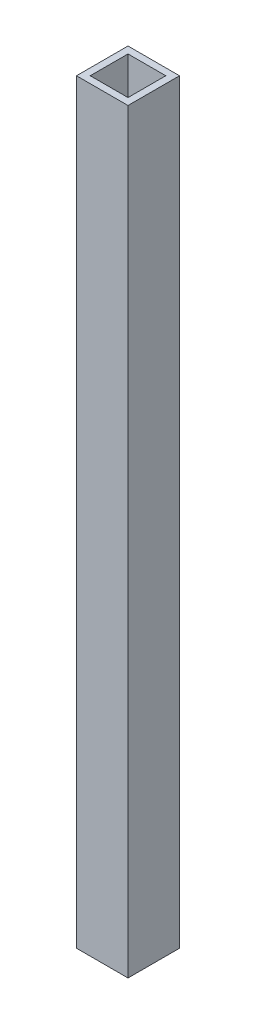
ISO-10303-21;
HEADER;
FILE_DESCRIPTION(('STEP AP214'),'2;1');
FILE_NAME('part.step','',(''),(''),'','','');
FILE_SCHEMA(('AUTOMOTIVE_DESIGN { 1 0 10303 214 1 1 1 1 }'));
ENDSEC;
DATA;
#1=APPLICATION_CONTEXT('core data for automotive mechanical design processes');
#2=APPLICATION_PROTOCOL_DEFINITION('international standard','automotive_design',2000,#1);
#3=PRODUCT_CONTEXT('',#1,'mechanical');
#4=PRODUCT('Part','Part','',(#3));
#5=PRODUCT_RELATED_PRODUCT_CATEGORY('part','',(#4));
#6=PRODUCT_DEFINITION_FORMATION('','',#4);
#7=PRODUCT_DEFINITION_CONTEXT('part definition',#1,'design');
#8=PRODUCT_DEFINITION('design','',#6,#7);
#9=PRODUCT_DEFINITION_SHAPE('','',#8);
#10=(LENGTH_UNIT() NAMED_UNIT(*) SI_UNIT(.MILLI.,.METRE.));
#11=(NAMED_UNIT(*) PLANE_ANGLE_UNIT() SI_UNIT($,.RADIAN.));
#12=(NAMED_UNIT(*) SI_UNIT($,.STERADIAN.) SOLID_ANGLE_UNIT());
#13=UNCERTAINTY_MEASURE_WITH_UNIT(LENGTH_MEASURE(1.E-05),#10,'distance_accuracy_value','');
#14=(GEOMETRIC_REPRESENTATION_CONTEXT(3) GLOBAL_UNCERTAINTY_ASSIGNED_CONTEXT((#13)) GLOBAL_UNIT_ASSIGNED_CONTEXT((#10,
#11,#12)) REPRESENTATION_CONTEXT('',''));
#15=CARTESIAN_POINT('',(0.,0.,0.));
#16=DIRECTION('',(0.,0.,1.));
#17=DIRECTION('',(1.,0.,0.));
#18=AXIS2_PLACEMENT_3D('',#15,#16,#17);
#19=CARTESIAN_POINT('',(0.,220.,0.));
#20=DIRECTION('',(0.,-1.,0.));
#21=DIRECTION('',(0.,0.,-1.));
#22=AXIS2_PLACEMENT_3D('',#19,#20,#21);
#23=PLANE('',#22);
#24=DIRECTION('',(0.,0.,1.));
#25=VECTOR('',#24,1.);
#26=CARTESIAN_POINT('',(0.,220.,0.));
#27=LINE('',#26,#25);
#28=CARTESIAN_POINT('',(0.,220.,-15.));
#29=VERTEX_POINT('',#28);
#30=CARTESIAN_POINT('',(0.,220.,0.));
#31=VERTEX_POINT('',#30);
#32=EDGE_CURVE('E157',#29,#31,#27,.T.);
#33=ORIENTED_EDGE('',*,*,#32,.T.);
#34=DIRECTION('',(1.,0.,0.));
#35=VECTOR('',#34,1.);
#36=CARTESIAN_POINT('',(0.,220.,0.));
#37=LINE('',#36,#35);
#38=CARTESIAN_POINT('',(15.,220.,0.));
#39=VERTEX_POINT('',#38);
#40=EDGE_CURVE('E161',#31,#39,#37,.T.);
#41=ORIENTED_EDGE('',*,*,#40,.T.);
#42=DIRECTION('',(0.,0.,-1.));
#43=VECTOR('',#42,1.);
#44=CARTESIAN_POINT('',(15.,220.,0.));
#45=LINE('',#44,#43);
#46=CARTESIAN_POINT('',(15.,220.,-15.));
#47=VERTEX_POINT('',#46);
#48=EDGE_CURVE('E165',#39,#47,#45,.T.);
#49=ORIENTED_EDGE('',*,*,#48,.T.);
#50=DIRECTION('',(-1.,0.,0.));
#51=VECTOR('',#50,1.);
#52=CARTESIAN_POINT('',(0.,220.,-15.));
#53=LINE('',#52,#51);
#54=EDGE_CURVE('E168',#47,#29,#53,.T.);
#55=ORIENTED_EDGE('',*,*,#54,.T.);
#56=EDGE_LOOP('',(#33,#41,#49,#55));
#57=FACE_BOUND('',#56,.T.);
#58=DIRECTION('',(1.,0.,0.));
#59=VECTOR('',#58,1.);
#60=CARTESIAN_POINT('',(2.,220.,-2.));
#61=LINE('',#60,#59);
#62=CARTESIAN_POINT('',(2.,220.,-2.));
#63=VERTEX_POINT('',#62);
#64=CARTESIAN_POINT('',(13.,220.,-2.));
#65=VERTEX_POINT('',#64);
#66=EDGE_CURVE('E109',#63,#65,#61,.T.);
#67=ORIENTED_EDGE('',*,*,#66,.F.);
#68=DIRECTION('',(0.,0.,1.));
#69=VECTOR('',#68,1.);
#70=CARTESIAN_POINT('',(2.,220.,-2.));
#71=LINE('',#70,#69);
#72=CARTESIAN_POINT('',(2.,220.,-13.));
#73=VERTEX_POINT('',#72);
#74=EDGE_CURVE('E135',#73,#63,#71,.T.);
#75=ORIENTED_EDGE('',*,*,#74,.F.);
#76=DIRECTION('',(-1.,0.,0.));
#77=VECTOR('',#76,1.);
#78=CARTESIAN_POINT('',(2.,220.,-13.));
#79=LINE('',#78,#77);
#80=CARTESIAN_POINT('',(13.,220.,-13.));
#81=VERTEX_POINT('',#80);
#82=EDGE_CURVE('E131',#81,#73,#79,.T.);
#83=ORIENTED_EDGE('',*,*,#82,.F.);
#84=DIRECTION('',(0.,0.,-1.));
#85=VECTOR('',#84,1.);
#86=CARTESIAN_POINT('',(13.,220.,-2.));
#87=LINE('',#86,#85);
#88=EDGE_CURVE('E118',#65,#81,#87,.T.);
#89=ORIENTED_EDGE('',*,*,#88,.F.);
#90=EDGE_LOOP('',(#67,#75,#83,#89));
#91=FACE_BOUND('',#90,.T.);
#92=ADVANCED_FACE('F43',(#57,#91),#23,.F.);
#93=CARTESIAN_POINT('',(0.,0.,0.));
#94=DIRECTION('',(0.,-1.,0.));
#95=DIRECTION('',(0.,0.,-1.));
#96=AXIS2_PLACEMENT_3D('',#93,#94,#95);
#97=PLANE('',#96);
#98=DIRECTION('',(0.,0.,1.));
#99=VECTOR('',#98,1.);
#100=CARTESIAN_POINT('',(0.,0.,0.));
#101=LINE('',#100,#99);
#102=CARTESIAN_POINT('',(0.,0.,-15.));
#103=VERTEX_POINT('',#102);
#104=CARTESIAN_POINT('',(0.,0.,0.));
#105=VERTEX_POINT('',#104);
#106=EDGE_CURVE('E127',#103,#105,#101,.T.);
#107=ORIENTED_EDGE('',*,*,#106,.F.);
#108=DIRECTION('',(-1.,0.,0.));
#109=VECTOR('',#108,1.);
#110=CARTESIAN_POINT('',(0.,0.,-15.));
#111=LINE('',#110,#109);
#112=CARTESIAN_POINT('',(15.,0.,-15.));
#113=VERTEX_POINT('',#112);
#114=EDGE_CURVE('E162',#113,#103,#111,.T.);
#115=ORIENTED_EDGE('',*,*,#114,.F.);
#116=DIRECTION('',(0.,0.,-1.));
#117=VECTOR('',#116,1.);
#118=CARTESIAN_POINT('',(15.,0.,0.));
#119=LINE('',#118,#117);
#120=CARTESIAN_POINT('',(15.,0.,0.));
#121=VERTEX_POINT('',#120);
#122=EDGE_CURVE('E178',#121,#113,#119,.T.);
#123=ORIENTED_EDGE('',*,*,#122,.F.);
#124=DIRECTION('',(1.,0.,0.));
#125=VECTOR('',#124,1.);
#126=CARTESIAN_POINT('',(0.,0.,0.));
#127=LINE('',#126,#125);
#128=EDGE_CURVE('E175',#105,#121,#127,.T.);
#129=ORIENTED_EDGE('',*,*,#128,.F.);
#130=EDGE_LOOP('',(#107,#115,#123,#129));
#131=FACE_BOUND('',#130,.T.);
#132=DIRECTION('',(0.,0.,1.));
#133=VECTOR('',#132,1.);
#134=CARTESIAN_POINT('',(2.,0.,-2.));
#135=LINE('',#134,#133);
#136=CARTESIAN_POINT('',(2.,0.,-13.));
#137=VERTEX_POINT('',#136);
#138=CARTESIAN_POINT('',(2.,0.,-2.));
#139=VERTEX_POINT('',#138);
#140=EDGE_CURVE('E119',#137,#139,#135,.T.);
#141=ORIENTED_EDGE('',*,*,#140,.T.);
#142=DIRECTION('',(1.,0.,0.));
#143=VECTOR('',#142,1.);
#144=CARTESIAN_POINT('',(2.,0.,-2.));
#145=LINE('',#144,#143);
#146=CARTESIAN_POINT('',(13.,0.,-2.));
#147=VERTEX_POINT('',#146);
#148=EDGE_CURVE('E67',#139,#147,#145,.T.);
#149=ORIENTED_EDGE('',*,*,#148,.T.);
#150=DIRECTION('',(0.,0.,-1.));
#151=VECTOR('',#150,1.);
#152=CARTESIAN_POINT('',(13.,0.,-2.));
#153=LINE('',#152,#151);
#154=CARTESIAN_POINT('',(13.,0.,-13.));
#155=VERTEX_POINT('',#154);
#156=EDGE_CURVE('E125',#147,#155,#153,.T.);
#157=ORIENTED_EDGE('',*,*,#156,.T.);
#158=DIRECTION('',(-1.,0.,0.));
#159=VECTOR('',#158,1.);
#160=CARTESIAN_POINT('',(2.,0.,-13.));
#161=LINE('',#160,#159);
#162=EDGE_CURVE('E144',#155,#137,#161,.T.);
#163=ORIENTED_EDGE('',*,*,#162,.T.);
#164=EDGE_LOOP('',(#141,#149,#157,#163));
#165=FACE_BOUND('',#164,.T.);
#166=ADVANCED_FACE('F201',(#131,#165),#97,.T.);
#167=CARTESIAN_POINT('',(0.,220.,0.));
#168=DIRECTION('',(1.,0.,0.));
#169=DIRECTION('',(0.,0.,-1.));
#170=AXIS2_PLACEMENT_3D('',#167,#168,#169);
#171=PLANE('',#170);
#172=ORIENTED_EDGE('',*,*,#106,.T.);
#173=DIRECTION('',(0.,-1.,0.));
#174=VECTOR('',#173,1.);
#175=CARTESIAN_POINT('',(0.,220.,0.));
#176=LINE('',#175,#174);
#177=EDGE_CURVE('E11',#31,#105,#176,.T.);
#178=ORIENTED_EDGE('',*,*,#177,.F.);
#179=ORIENTED_EDGE('',*,*,#32,.F.);
#180=DIRECTION('',(0.,-1.,0.));
#181=VECTOR('',#180,1.);
#182=CARTESIAN_POINT('',(0.,220.,-15.));
#183=LINE('',#182,#181);
#184=EDGE_CURVE('E171',#29,#103,#183,.T.);
#185=ORIENTED_EDGE('',*,*,#184,.T.);
#186=EDGE_LOOP('',(#172,#178,#179,#185));
#187=FACE_BOUND('',#186,.T.);
#188=ADVANCED_FACE('F45',(#187),#171,.F.);
#189=CARTESIAN_POINT('',(0.,220.,0.));
#190=DIRECTION('',(0.,0.,-1.));
#191=DIRECTION('',(-1.,0.,0.));
#192=AXIS2_PLACEMENT_3D('',#189,#190,#191);
#193=PLANE('',#192);
#194=ORIENTED_EDGE('',*,*,#128,.T.);
#195=DIRECTION('',(0.,-1.,0.));
#196=VECTOR('',#195,1.);
#197=CARTESIAN_POINT('',(15.,220.,0.));
#198=LINE('',#197,#196);
#199=EDGE_CURVE('E52',#39,#121,#198,.T.);
#200=ORIENTED_EDGE('',*,*,#199,.F.);
#201=ORIENTED_EDGE('',*,*,#40,.F.);
#202=ORIENTED_EDGE('',*,*,#177,.T.);
#203=EDGE_LOOP('',(#194,#200,#201,#202));
#204=FACE_BOUND('',#203,.T.);
#205=ADVANCED_FACE('F211',(#204),#193,.F.);
#206=CARTESIAN_POINT('',(15.,220.,0.));
#207=DIRECTION('',(-1.,0.,0.));
#208=DIRECTION('',(0.,0.,1.));
#209=AXIS2_PLACEMENT_3D('',#206,#207,#208);
#210=PLANE('',#209);
#211=ORIENTED_EDGE('',*,*,#122,.T.);
#212=DIRECTION('',(0.,-1.,0.));
#213=VECTOR('',#212,1.);
#214=CARTESIAN_POINT('',(15.,220.,-15.));
#215=LINE('',#214,#213);
#216=EDGE_CURVE('E186',#47,#113,#215,.T.);
#217=ORIENTED_EDGE('',*,*,#216,.F.);
#218=ORIENTED_EDGE('',*,*,#48,.F.);
#219=ORIENTED_EDGE('',*,*,#199,.T.);
#220=EDGE_LOOP('',(#211,#217,#218,#219));
#221=FACE_BOUND('',#220,.T.);
#222=ADVANCED_FACE('F195',(#221),#210,.F.);
#223=CARTESIAN_POINT('',(0.,220.,-15.));
#224=DIRECTION('',(0.,0.,1.));
#225=DIRECTION('',(1.,0.,0.));
#226=AXIS2_PLACEMENT_3D('',#223,#224,#225);
#227=PLANE('',#226);
#228=ORIENTED_EDGE('',*,*,#114,.T.);
#229=ORIENTED_EDGE('',*,*,#184,.F.);
#230=ORIENTED_EDGE('',*,*,#54,.F.);
#231=ORIENTED_EDGE('',*,*,#216,.T.);
#232=EDGE_LOOP('',(#228,#229,#230,#231));
#233=FACE_BOUND('',#232,.T.);
#234=ADVANCED_FACE('F205',(#233),#227,.F.);
#235=CARTESIAN_POINT('',(2.,220.,-2.));
#236=DIRECTION('',(0.,0.,-1.));
#237=DIRECTION('',(-1.,0.,0.));
#238=AXIS2_PLACEMENT_3D('',#235,#236,#237);
#239=PLANE('',#238);
#240=ORIENTED_EDGE('',*,*,#148,.F.);
#241=DIRECTION('',(0.,-1.,0.));
#242=VECTOR('',#241,1.);
#243=CARTESIAN_POINT('',(2.,220.,-2.));
#244=LINE('',#243,#242);
#245=EDGE_CURVE('E113',#63,#139,#244,.T.);
#246=ORIENTED_EDGE('',*,*,#245,.F.);
#247=ORIENTED_EDGE('',*,*,#66,.T.);
#248=DIRECTION('',(0.,-1.,0.));
#249=VECTOR('',#248,1.);
#250=CARTESIAN_POINT('',(13.,220.,-2.));
#251=LINE('',#250,#249);
#252=EDGE_CURVE('E112',#65,#147,#251,.T.);
#253=ORIENTED_EDGE('',*,*,#252,.T.);
#254=EDGE_LOOP('',(#240,#246,#247,#253));
#255=FACE_BOUND('',#254,.T.);
#256=ADVANCED_FACE('F111',(#255),#239,.T.);
#257=CARTESIAN_POINT('',(13.,220.,-2.));
#258=DIRECTION('',(-1.,0.,0.));
#259=DIRECTION('',(0.,0.,1.));
#260=AXIS2_PLACEMENT_3D('',#257,#258,#259);
#261=PLANE('',#260);
#262=ORIENTED_EDGE('',*,*,#156,.F.);
#263=ORIENTED_EDGE('',*,*,#252,.F.);
#264=ORIENTED_EDGE('',*,*,#88,.T.);
#265=DIRECTION('',(0.,-1.,0.));
#266=VECTOR('',#265,1.);
#267=CARTESIAN_POINT('',(13.,220.,-13.));
#268=LINE('',#267,#266);
#269=EDGE_CURVE('E128',#81,#155,#268,.T.);
#270=ORIENTED_EDGE('',*,*,#269,.T.);
#271=EDGE_LOOP('',(#262,#263,#264,#270));
#272=FACE_BOUND('',#271,.T.);
#273=ADVANCED_FACE('F122',(#272),#261,.T.);
#274=CARTESIAN_POINT('',(2.,220.,-13.));
#275=DIRECTION('',(0.,0.,1.));
#276=DIRECTION('',(1.,0.,0.));
#277=AXIS2_PLACEMENT_3D('',#274,#275,#276);
#278=PLANE('',#277);
#279=ORIENTED_EDGE('',*,*,#162,.F.);
#280=ORIENTED_EDGE('',*,*,#269,.F.);
#281=ORIENTED_EDGE('',*,*,#82,.T.);
#282=DIRECTION('',(0.,-1.,0.));
#283=VECTOR('',#282,1.);
#284=CARTESIAN_POINT('',(2.,220.,-13.));
#285=LINE('',#284,#283);
#286=EDGE_CURVE('E59',#73,#137,#285,.T.);
#287=ORIENTED_EDGE('',*,*,#286,.T.);
#288=EDGE_LOOP('',(#279,#280,#281,#287));
#289=FACE_BOUND('',#288,.T.);
#290=ADVANCED_FACE('F234',(#289),#278,.T.);
#291=CARTESIAN_POINT('',(2.,220.,-2.));
#292=DIRECTION('',(1.,0.,0.));
#293=DIRECTION('',(0.,0.,-1.));
#294=AXIS2_PLACEMENT_3D('',#291,#292,#293);
#295=PLANE('',#294);
#296=ORIENTED_EDGE('',*,*,#140,.F.);
#297=ORIENTED_EDGE('',*,*,#286,.F.);
#298=ORIENTED_EDGE('',*,*,#74,.T.);
#299=ORIENTED_EDGE('',*,*,#245,.T.);
#300=EDGE_LOOP('',(#296,#297,#298,#299));
#301=FACE_BOUND('',#300,.T.);
#302=ADVANCED_FACE('F238',(#301),#295,.T.);
#303=CLOSED_SHELL('',(#92,#166,#188,#205,#222,#234,#256,#273,#290,#302));
#304=MANIFOLD_SOLID_BREP('B2',#303);
#305=ADVANCED_BREP_SHAPE_REPRESENTATION('',(#18,#304),#14);
#306=SHAPE_DEFINITION_REPRESENTATION(#9,#305);
ENDSEC;
END-ISO-10303-21;
